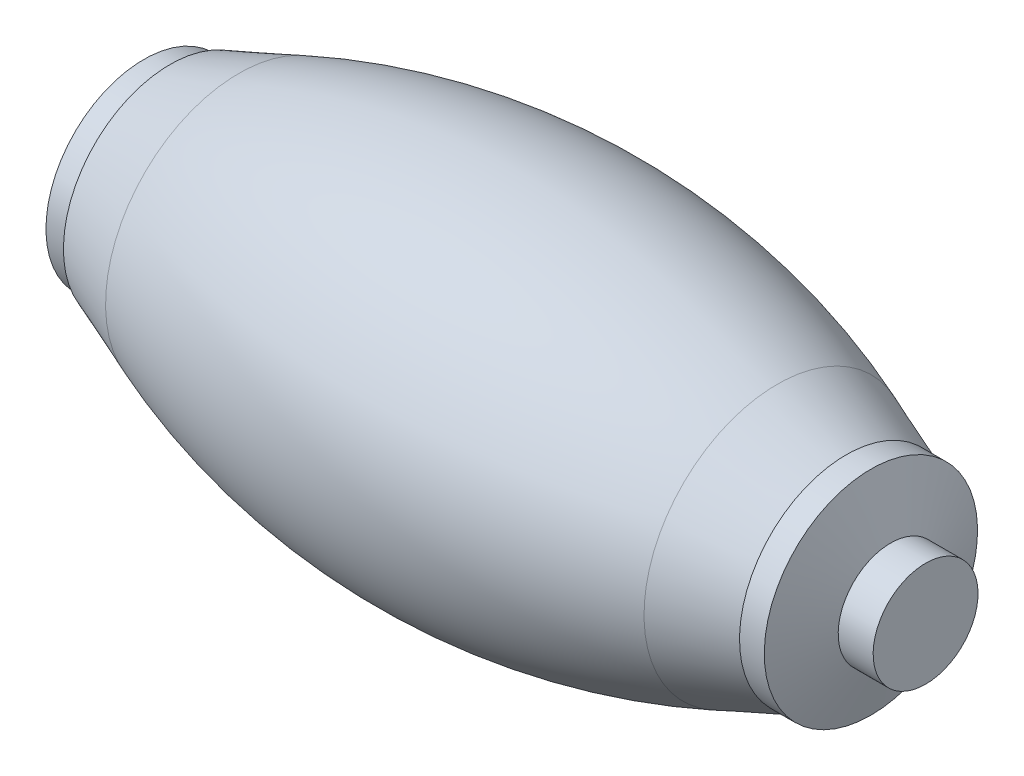
ISO-10303-21;
HEADER;
FILE_DESCRIPTION(('STEP AP214'),'2;1');
FILE_NAME('part.step','',(''),(''),'','','');
FILE_SCHEMA(('AUTOMOTIVE_DESIGN { 1 0 10303 214 1 1 1 1 }'));
ENDSEC;
DATA;
#1=APPLICATION_CONTEXT('core data for automotive mechanical design processes');
#2=APPLICATION_PROTOCOL_DEFINITION('international standard','automotive_design',2000,#1);
#3=PRODUCT_CONTEXT('',#1,'mechanical');
#4=PRODUCT('Part','Part','',(#3));
#5=PRODUCT_RELATED_PRODUCT_CATEGORY('part','',(#4));
#6=PRODUCT_DEFINITION_FORMATION('','',#4);
#7=PRODUCT_DEFINITION_CONTEXT('part definition',#1,'design');
#8=PRODUCT_DEFINITION('design','',#6,#7);
#9=PRODUCT_DEFINITION_SHAPE('','',#8);
#10=(LENGTH_UNIT() NAMED_UNIT(*) SI_UNIT(.MILLI.,.METRE.));
#11=(NAMED_UNIT(*) PLANE_ANGLE_UNIT() SI_UNIT($,.RADIAN.));
#12=(NAMED_UNIT(*) SI_UNIT($,.STERADIAN.) SOLID_ANGLE_UNIT());
#13=UNCERTAINTY_MEASURE_WITH_UNIT(LENGTH_MEASURE(1.E-05),#10,'distance_accuracy_value','');
#14=(GEOMETRIC_REPRESENTATION_CONTEXT(3) GLOBAL_UNCERTAINTY_ASSIGNED_CONTEXT((#13)) GLOBAL_UNIT_ASSIGNED_CONTEXT((#10,
#11,#12)) REPRESENTATION_CONTEXT('',''));
#15=CARTESIAN_POINT('',(0.,0.,0.));
#16=DIRECTION('',(0.,0.,1.));
#17=DIRECTION('',(1.,0.,0.));
#18=AXIS2_PLACEMENT_3D('',#15,#16,#17);
#19=CARTESIAN_POINT('',(-142.,0.,0.));
#20=DIRECTION('',(1.,0.,0.));
#21=DIRECTION('',(0.,1.,0.));
#22=AXIS2_PLACEMENT_3D('',#19,#20,#21);
#23=PLANE('',#22);
#24=CARTESIAN_POINT('',(-142.,-1.44306098349841E-12,0.));
#25=DIRECTION('',(-1.,0.,0.));
#26=DIRECTION('',(0.,-1.,0.));
#27=AXIS2_PLACEMENT_3D('',#24,#25,#26);
#28=CIRCLE('',#27,35.5600000000016);
#29=CARTESIAN_POINT('',(-142.,-35.560000000003,0.));
#30=VERTEX_POINT('',#29);
#31=EDGE_CURVE('E10',#30,#30,#28,.T.);
#32=ORIENTED_EDGE('',*,*,#31,.T.);
#33=EDGE_LOOP('',(#32));
#34=FACE_BOUND('',#33,.T.);
#35=ADVANCED_FACE('F31',(#34),#23,.F.);
#36=CARTESIAN_POINT('',(142.,0.,0.));
#37=DIRECTION('',(-1.,0.,0.));
#38=DIRECTION('',(0.,-1.,0.));
#39=AXIS2_PLACEMENT_3D('',#36,#37,#38);
#40=CYLINDRICAL_SURFACE('',#39,35.5600000000016);
#41=ORIENTED_EDGE('',*,*,#31,.F.);
#42=EDGE_LOOP('',(#41));
#43=FACE_BOUND('',#42,.T.);
#44=CARTESIAN_POINT('',(-132.475,-1.39568916951046E-12,0.));
#45=DIRECTION('',(-1.,0.,0.));
#46=DIRECTION('',(0.,-1.,0.));
#47=AXIS2_PLACEMENT_3D('',#44,#45,#46);
#48=CIRCLE('',#47,35.5600000000015);
#49=CARTESIAN_POINT('',(-132.475,-35.5600000000029,0.));
#50=VERTEX_POINT('',#49);
#51=EDGE_CURVE('E37',#50,#50,#48,.T.);
#52=ORIENTED_EDGE('',*,*,#51,.T.);
#53=EDGE_LOOP('',(#52));
#54=FACE_BOUND('',#53,.T.);
#55=ADVANCED_FACE('F78',(#43,#54),#40,.T.);
#56=CARTESIAN_POINT('',(-132.475,35.5600000000001,0.));
#57=DIRECTION('',(1.,0.,0.));
#58=DIRECTION('',(0.,1.,0.));
#59=AXIS2_PLACEMENT_3D('',#56,#57,#58);
#60=PLANE('',#59);
#61=ORIENTED_EDGE('',*,*,#51,.F.);
#62=EDGE_LOOP('',(#61));
#63=FACE_BOUND('',#62,.T.);
#64=CARTESIAN_POINT('',(-132.475,-1.39568916951046E-12,0.));
#65=DIRECTION('',(-1.,0.,0.));
#66=DIRECTION('',(0.,-1.,0.));
#67=AXIS2_PLACEMENT_3D('',#64,#65,#66);
#68=CIRCLE('',#67,38.7350000000015);
#69=CARTESIAN_POINT('',(-132.475,-38.7350000000029,0.));
#70=VERTEX_POINT('',#69);
#71=EDGE_CURVE('E41',#70,#70,#68,.T.);
#72=ORIENTED_EDGE('',*,*,#71,.T.);
#73=EDGE_LOOP('',(#72));
#74=FACE_BOUND('',#73,.T.);
#75=ADVANCED_FACE('F82',(#63,#74),#60,.F.);
#76=CARTESIAN_POINT('',(-107.475,-1.2713536997258E-12,0.));
#77=DIRECTION('',(1.,0.,0.));
#78=DIRECTION('',(0.,1.,0.));
#79=AXIS2_PLACEMENT_3D('',#76,#77,#78);
#80=CONICAL_SURFACE('',#79,48.4318886954774,0.370010766432671);
#81=ORIENTED_EDGE('',*,*,#71,.F.);
#82=EDGE_LOOP('',(#81));
#83=FACE_BOUND('',#82,.T.);
#84=CARTESIAN_POINT('',(-107.475,-1.2713536997258E-12,0.));
#85=DIRECTION('',(-1.,0.,0.));
#86=DIRECTION('',(0.,-1.,0.));
#87=AXIS2_PLACEMENT_3D('',#84,#85,#86);
#88=CIRCLE('',#87,48.4318886954774);
#89=CARTESIAN_POINT('',(-107.474999999999,-48.4318886954787,0.));
#90=VERTEX_POINT('',#89);
#91=EDGE_CURVE('E45',#90,#90,#88,.T.);
#92=ORIENTED_EDGE('',*,*,#91,.T.);
#93=EDGE_LOOP('',(#92));
#94=FACE_BOUND('',#93,.T.);
#95=ADVANCED_FACE('F87',(#83,#94),#80,.T.);
#96=CARTESIAN_POINT('',(-9.66987703076608,-7.7715611723761E-13,0.));
#97=DIRECTION('',(-1.,0.,0.));
#98=DIRECTION('',(0.,-1.,0.));
#99=AXIS2_PLACEMENT_3D('',#96,#97,#98);
#100=DEGENERATE_TOROIDAL_SURFACE('',#99,203.7240502885,270.45971907831,.F.);
#101=ORIENTED_EDGE('',*,*,#91,.F.);
#102=EDGE_LOOP('',(#101));
#103=FACE_BOUND('',#102,.T.);
#104=CARTESIAN_POINT('',(88.1352459384701,-2.98502026787705E-13,0.));
#105=DIRECTION('',(-1.,0.,0.));
#106=DIRECTION('',(0.,-1.,0.));
#107=AXIS2_PLACEMENT_3D('',#104,#105,#106);
#108=CIRCLE('',#107,48.4318886954765);
#109=CARTESIAN_POINT('',(88.1352459384703,-48.4318886954768,0.));
#110=VERTEX_POINT('',#109);
#111=EDGE_CURVE('E50',#110,#110,#108,.T.);
#112=ORIENTED_EDGE('',*,*,#111,.T.);
#113=EDGE_LOOP('',(#112));
#114=FACE_BOUND('',#113,.T.);
#115=ADVANCED_FACE('F93',(#103,#114),#100,.F.);
#116=CARTESIAN_POINT('',(113.13524593847,-1.74166557003047E-13,0.));
#117=DIRECTION('',(-1.,0.,0.));
#118=DIRECTION('',(0.,-1.,0.));
#119=AXIS2_PLACEMENT_3D('',#116,#117,#118);
#120=CONICAL_SURFACE('',#119,38.7350000000003,0.370010766432682);
#121=ORIENTED_EDGE('',*,*,#111,.F.);
#122=EDGE_LOOP('',(#121));
#123=FACE_BOUND('',#122,.T.);
#124=CARTESIAN_POINT('',(113.13524593847,-1.74166557003047E-13,0.));
#125=DIRECTION('',(-1.,0.,0.));
#126=DIRECTION('',(0.,-1.,0.));
#127=AXIS2_PLACEMENT_3D('',#124,#125,#126);
#128=CIRCLE('',#127,38.7350000000003);
#129=CARTESIAN_POINT('',(113.13524593847,-38.7350000000005,0.));
#130=VERTEX_POINT('',#129);
#131=EDGE_CURVE('E53',#130,#130,#128,.T.);
#132=ORIENTED_EDGE('',*,*,#131,.T.);
#133=EDGE_LOOP('',(#132));
#134=FACE_BOUND('',#133,.T.);
#135=ADVANCED_FACE('F97',(#123,#134),#120,.T.);
#136=CARTESIAN_POINT('',(142.,0.,0.));
#137=DIRECTION('',(-1.,0.,0.));
#138=DIRECTION('',(0.,-1.,0.));
#139=AXIS2_PLACEMENT_3D('',#136,#137,#138);
#140=CYLINDRICAL_SURFACE('',#139,38.7350000000003);
#141=ORIENTED_EDGE('',*,*,#131,.F.);
#142=EDGE_LOOP('',(#141));
#143=FACE_BOUND('',#142,.T.);
#144=CARTESIAN_POINT('',(122.13524593847,-1.2940578788057E-13,0.));
#145=DIRECTION('',(-1.,0.,0.));
#146=DIRECTION('',(0.,-1.,0.));
#147=AXIS2_PLACEMENT_3D('',#144,#145,#146);
#148=CIRCLE('',#147,38.7350000000002);
#149=CARTESIAN_POINT('',(122.13524593847,-38.7350000000004,0.));
#150=VERTEX_POINT('',#149);
#151=EDGE_CURVE('E56',#150,#150,#148,.T.);
#152=ORIENTED_EDGE('',*,*,#151,.T.);
#153=EDGE_LOOP('',(#152));
#154=FACE_BOUND('',#153,.T.);
#155=ADVANCED_FACE('F101',(#143,#154),#140,.T.);
#156=CARTESIAN_POINT('',(129.3,0.,0.));
#157=DIRECTION('',(-1.,0.,0.));
#158=DIRECTION('',(0.,-1.,0.));
#159=AXIS2_PLACEMENT_3D('',#156,#157,#158);
#160=CONICAL_SURFACE('',#159,19.0500000000001,1.22173047639604);
#161=ORIENTED_EDGE('',*,*,#151,.F.);
#162=EDGE_LOOP('',(#161));
#163=FACE_BOUND('',#162,.T.);
#164=CARTESIAN_POINT('',(129.3,0.,0.));
#165=DIRECTION('',(-1.,0.,0.));
#166=DIRECTION('',(0.,-1.,0.));
#167=AXIS2_PLACEMENT_3D('',#164,#165,#166);
#168=CIRCLE('',#167,19.0500000000001);
#169=CARTESIAN_POINT('',(129.3,-19.0500000000002,0.));
#170=VERTEX_POINT('',#169);
#171=EDGE_CURVE('E59',#170,#170,#168,.T.);
#172=ORIENTED_EDGE('',*,*,#171,.T.);
#173=EDGE_LOOP('',(#172));
#174=FACE_BOUND('',#173,.T.);
#175=ADVANCED_FACE('F74',(#163,#174),#160,.T.);
#176=CARTESIAN_POINT('',(142.,0.,0.));
#177=DIRECTION('',(-1.,0.,0.));
#178=DIRECTION('',(0.,-1.,0.));
#179=AXIS2_PLACEMENT_3D('',#176,#177,#178);
#180=CYLINDRICAL_SURFACE('',#179,19.0500000000001);
#181=ORIENTED_EDGE('',*,*,#171,.F.);
#182=EDGE_LOOP('',(#181));
#183=FACE_BOUND('',#182,.T.);
#184=CARTESIAN_POINT('',(142.,0.,0.));
#185=DIRECTION('',(-1.,0.,0.));
#186=DIRECTION('',(0.,-1.,0.));
#187=AXIS2_PLACEMENT_3D('',#184,#185,#186);
#188=CIRCLE('',#187,19.05);
#189=CARTESIAN_POINT('',(142.,-19.0500000000001,0.));
#190=VERTEX_POINT('',#189);
#191=EDGE_CURVE('E62',#190,#190,#188,.T.);
#192=ORIENTED_EDGE('',*,*,#191,.T.);
#193=EDGE_LOOP('',(#192));
#194=FACE_BOUND('',#193,.T.);
#195=ADVANCED_FACE('F66',(#183,#194),#180,.T.);
#196=CARTESIAN_POINT('',(142.,19.05,0.));
#197=DIRECTION('',(-1.,0.,0.));
#198=DIRECTION('',(0.,-1.,0.));
#199=AXIS2_PLACEMENT_3D('',#196,#197,#198);
#200=PLANE('',#199);
#201=ORIENTED_EDGE('',*,*,#191,.F.);
#202=EDGE_LOOP('',(#201));
#203=FACE_BOUND('',#202,.T.);
#204=ADVANCED_FACE('F68',(#203),#200,.F.);
#205=CLOSED_SHELL('',(#35,#55,#75,#95,#115,#135,#155,#175,#195,#204));
#206=MANIFOLD_SOLID_BREP('B2',#205);
#207=ADVANCED_BREP_SHAPE_REPRESENTATION('',(#18,#206),#14);
#208=SHAPE_DEFINITION_REPRESENTATION(#9,#207);
ENDSEC;
END-ISO-10303-21;
